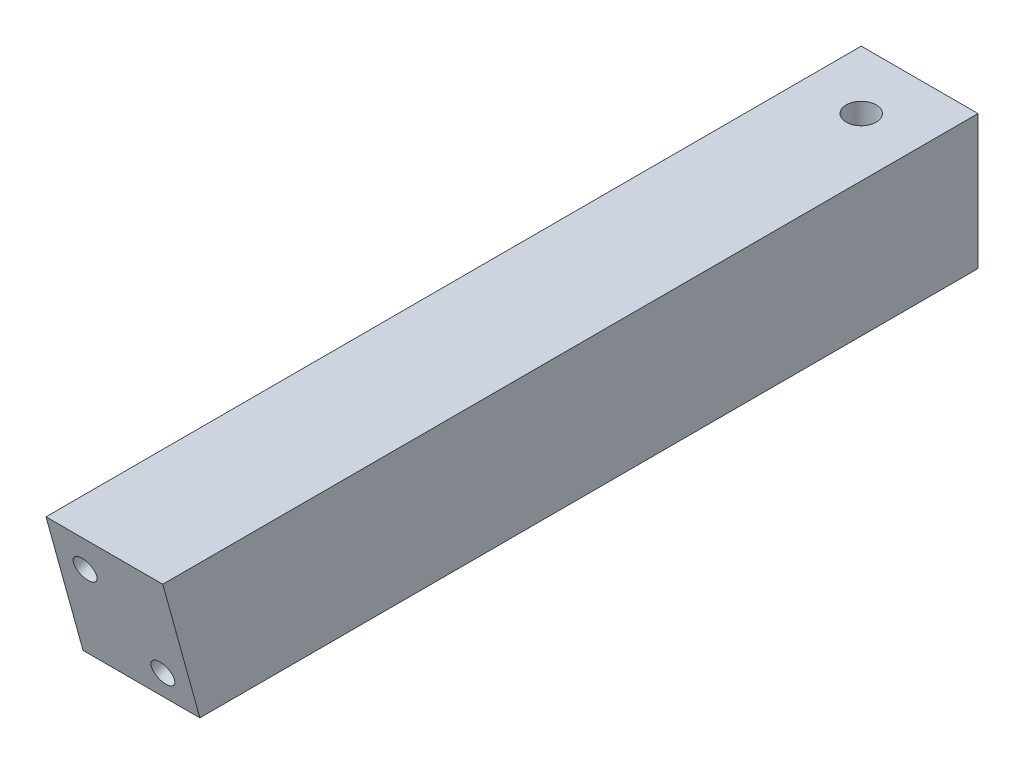
ISO-10303-21;
HEADER;
FILE_DESCRIPTION(('STEP AP214'),'2;1');
FILE_NAME('part.step','',(''),(''),'','','');
FILE_SCHEMA(('AUTOMOTIVE_DESIGN { 1 0 10303 214 1 1 1 1 }'));
ENDSEC;
DATA;
#1=APPLICATION_CONTEXT('core data for automotive mechanical design processes');
#2=APPLICATION_PROTOCOL_DEFINITION('international standard','automotive_design',2000,#1);
#3=PRODUCT_CONTEXT('',#1,'mechanical');
#4=PRODUCT('Part','Part','',(#3));
#5=PRODUCT_RELATED_PRODUCT_CATEGORY('part','',(#4));
#6=PRODUCT_DEFINITION_FORMATION('','',#4);
#7=PRODUCT_DEFINITION_CONTEXT('part definition',#1,'design');
#8=PRODUCT_DEFINITION('design','',#6,#7);
#9=PRODUCT_DEFINITION_SHAPE('','',#8);
#10=(LENGTH_UNIT() NAMED_UNIT(*) SI_UNIT(.MILLI.,.METRE.));
#11=(NAMED_UNIT(*) PLANE_ANGLE_UNIT() SI_UNIT($,.RADIAN.));
#12=(NAMED_UNIT(*) SI_UNIT($,.STERADIAN.) SOLID_ANGLE_UNIT());
#13=UNCERTAINTY_MEASURE_WITH_UNIT(LENGTH_MEASURE(1.E-05),#10,'distance_accuracy_value','');
#14=(GEOMETRIC_REPRESENTATION_CONTEXT(3) GLOBAL_UNCERTAINTY_ASSIGNED_CONTEXT((#13)) GLOBAL_UNIT_ASSIGNED_CONTEXT((#10,
#11,#12)) REPRESENTATION_CONTEXT('',''));
#15=CARTESIAN_POINT('',(0.,0.,0.));
#16=DIRECTION('',(0.,0.,1.));
#17=DIRECTION('',(1.,0.,0.));
#18=AXIS2_PLACEMENT_3D('',#15,#16,#17);
#19=CARTESIAN_POINT('',(-233.303265585855,-866.048105190081,-78.4937864077664));
#20=DIRECTION('',(0.,-0.266119959453495,0.963939918864485));
#21=DIRECTION('',(0.,0.963939918864485,0.266119959453495));
#22=AXIS2_PLACEMENT_3D('',#19,#20,#21);
#23=PLANE('',#22);
#24=CARTESIAN_POINT('',(6.35,-8.48398151521049,158.258448202419));
#25=DIRECTION('',(0.,0.266119959453495,-0.963939918864485));
#26=DIRECTION('',(0.,0.963939918864485,0.266119959453495));
#27=AXIS2_PLACEMENT_3D('',#24,#25,#26);
#28=CIRCLE('',#27,2.52730000000012);
#29=CARTESIAN_POINT('',(6.35,-6.04781615826416,158.931013175946));
#30=VERTEX_POINT('',#29);
#31=EDGE_CURVE('E135',#30,#30,#28,.T.);
#32=ORIENTED_EDGE('',*,*,#31,.T.);
#33=EDGE_LOOP('',(#32));
#34=FACE_BOUND('',#33,.T.);
#35=CARTESIAN_POINT('',(-6.35,6.8185646967632,162.483102558744));
#36=DIRECTION('',(0.,0.266119959453495,-0.963939918864485));
#37=DIRECTION('',(0.,0.963939918864485,0.266119959453495));
#38=AXIS2_PLACEMENT_3D('',#35,#36,#37);
#39=CIRCLE('',#38,2.52730000000013);
#40=CARTESIAN_POINT('',(-6.35,9.25473005370954,163.15566753227));
#41=VERTEX_POINT('',#40);
#42=EDGE_CURVE('E138',#41,#41,#39,.T.);
#43=ORIENTED_EDGE('',*,*,#42,.T.);
#44=EDGE_LOOP('',(#43));
#45=FACE_BOUND('',#44,.T.);
#46=DIRECTION('',(0.,0.963939918864485,0.266119959453495));
#47=VECTOR('',#46,1.);
#48=CARTESIAN_POINT('',(12.7,-3.45517927347841,159.646776066511));
#49=LINE('',#48,#47);
#50=CARTESIAN_POINT('',(12.7,-14.605,156.56858645989));
#51=VERTEX_POINT('',#50);
#52=CARTESIAN_POINT('',(12.7,14.605,164.632744675055));
#53=VERTEX_POINT('',#52);
#54=EDGE_CURVE('E48',#51,#53,#49,.T.);
#55=ORIENTED_EDGE('',*,*,#54,.T.);
#56=DIRECTION('',(-1.,0.,0.));
#57=VECTOR('',#56,1.);
#58=CARTESIAN_POINT('',(-12.7,14.605,164.632744675055));
#59=LINE('',#58,#57);
#60=CARTESIAN_POINT('',(-12.7,14.605,164.632744675055));
#61=VERTEX_POINT('',#60);
#62=EDGE_CURVE('E99',#53,#61,#59,.T.);
#63=ORIENTED_EDGE('',*,*,#62,.T.);
#64=DIRECTION('',(0.,-0.963939918864485,-0.266119959453495));
#65=VECTOR('',#64,1.);
#66=CARTESIAN_POINT('',(-12.7,-3.45517927347841,159.646776066511));
#67=LINE('',#66,#65);
#68=CARTESIAN_POINT('',(-12.7,-14.605,156.56858645989));
#69=VERTEX_POINT('',#68);
#70=EDGE_CURVE('E111',#61,#69,#67,.T.);
#71=ORIENTED_EDGE('',*,*,#70,.T.);
#72=DIRECTION('',(1.,0.,0.));
#73=VECTOR('',#72,1.);
#74=CARTESIAN_POINT('',(-12.7,-14.605,156.56858645989));
#75=LINE('',#74,#73);
#76=EDGE_CURVE('E104',#69,#51,#75,.T.);
#77=ORIENTED_EDGE('',*,*,#76,.T.);
#78=EDGE_LOOP('',(#55,#63,#71,#77));
#79=FACE_BOUND('',#78,.T.);
#80=ADVANCED_FACE('F41',(#34,#45,#79),#23,.T.);
#81=CARTESIAN_POINT('',(-12.7,14.605,200.03366515423));
#82=DIRECTION('',(0.,1.,0.));
#83=DIRECTION('',(0.,0.,-1.));
#84=AXIS2_PLACEMENT_3D('',#81,#82,#83);
#85=PLANE('',#84);
#86=CARTESIAN_POINT('',(0.,14.605,0.));
#87=DIRECTION('',(0.,1.,0.));
#88=DIRECTION('',(0.,0.,1.));
#89=AXIS2_PLACEMENT_3D('',#86,#87,#88);
#90=CIRCLE('',#89,3.2639);
#91=CARTESIAN_POINT('',(0.,14.605,3.2639));
#92=VERTEX_POINT('',#91);
#93=EDGE_CURVE('E144',#92,#92,#90,.T.);
#94=ORIENTED_EDGE('',*,*,#93,.F.);
#95=EDGE_LOOP('',(#94));
#96=FACE_BOUND('',#95,.T.);
#97=DIRECTION('',(0.,0.,-1.));
#98=VECTOR('',#97,1.);
#99=CARTESIAN_POINT('',(12.7,14.605,200.03366515423));
#100=LINE('',#99,#98);
#101=CARTESIAN_POINT('',(12.7,14.605,-12.7));
#102=VERTEX_POINT('',#101);
#103=EDGE_CURVE('E11',#53,#102,#100,.T.);
#104=ORIENTED_EDGE('',*,*,#103,.T.);
#105=DIRECTION('',(-1.,0.,0.));
#106=VECTOR('',#105,1.);
#107=CARTESIAN_POINT('',(-12.7,14.605,-12.7));
#108=LINE('',#107,#106);
#109=CARTESIAN_POINT('',(-12.7,14.605,-12.7));
#110=VERTEX_POINT('',#109);
#111=EDGE_CURVE('E90',#102,#110,#108,.T.);
#112=ORIENTED_EDGE('',*,*,#111,.T.);
#113=DIRECTION('',(0.,0.,-1.));
#114=VECTOR('',#113,1.);
#115=CARTESIAN_POINT('',(-12.7,14.605,200.03366515423));
#116=LINE('',#115,#114);
#117=EDGE_CURVE('E61',#61,#110,#116,.T.);
#118=ORIENTED_EDGE('',*,*,#117,.F.);
#119=ORIENTED_EDGE('',*,*,#62,.F.);
#120=EDGE_LOOP('',(#104,#112,#118,#119));
#121=FACE_BOUND('',#120,.T.);
#122=ADVANCED_FACE('F97',(#96,#121),#85,.T.);
#123=CARTESIAN_POINT('',(-12.7,-14.605,200.03366515423));
#124=DIRECTION('',(-1.,0.,0.));
#125=DIRECTION('',(0.,0.,-1.));
#126=AXIS2_PLACEMENT_3D('',#123,#124,#125);
#127=PLANE('',#126);
#128=ORIENTED_EDGE('',*,*,#117,.T.);
#129=DIRECTION('',(0.,-1.,0.));
#130=VECTOR('',#129,1.);
#131=CARTESIAN_POINT('',(-12.7,-14.605,-12.7));
#132=LINE('',#131,#130);
#133=CARTESIAN_POINT('',(-12.7,-14.605,-12.7));
#134=VERTEX_POINT('',#133);
#135=EDGE_CURVE('E95',#110,#134,#132,.T.);
#136=ORIENTED_EDGE('',*,*,#135,.T.);
#137=DIRECTION('',(0.,0.,-1.));
#138=VECTOR('',#137,1.);
#139=CARTESIAN_POINT('',(-12.7,-14.605,200.03366515423));
#140=LINE('',#139,#138);
#141=EDGE_CURVE('E110',#69,#134,#140,.T.);
#142=ORIENTED_EDGE('',*,*,#141,.F.);
#143=ORIENTED_EDGE('',*,*,#70,.F.);
#144=EDGE_LOOP('',(#128,#136,#142,#143));
#145=FACE_BOUND('',#144,.T.);
#146=ADVANCED_FACE('F114',(#145),#127,.T.);
#147=CARTESIAN_POINT('',(-12.7,-14.605,200.03366515423));
#148=DIRECTION('',(0.,-1.,0.));
#149=DIRECTION('',(0.,0.,1.));
#150=AXIS2_PLACEMENT_3D('',#147,#148,#149);
#151=PLANE('',#150);
#152=CARTESIAN_POINT('',(0.,-14.605,0.));
#153=DIRECTION('',(0.,1.,0.));
#154=DIRECTION('',(0.,0.,1.));
#155=AXIS2_PLACEMENT_3D('',#152,#153,#154);
#156=CIRCLE('',#155,3.2639);
#157=CARTESIAN_POINT('',(0.,-14.605,3.2639));
#158=VERTEX_POINT('',#157);
#159=EDGE_CURVE('E150',#158,#158,#156,.T.);
#160=ORIENTED_EDGE('',*,*,#159,.T.);
#161=EDGE_LOOP('',(#160));
#162=FACE_BOUND('',#161,.T.);
#163=ORIENTED_EDGE('',*,*,#141,.T.);
#164=DIRECTION('',(1.,0.,0.));
#165=VECTOR('',#164,1.);
#166=CARTESIAN_POINT('',(-12.7,-14.605,-12.7));
#167=LINE('',#166,#165);
#168=CARTESIAN_POINT('',(12.7,-14.605,-12.7));
#169=VERTEX_POINT('',#168);
#170=EDGE_CURVE('E84',#134,#169,#167,.T.);
#171=ORIENTED_EDGE('',*,*,#170,.T.);
#172=DIRECTION('',(0.,0.,-1.));
#173=VECTOR('',#172,1.);
#174=CARTESIAN_POINT('',(12.7,-14.605,200.03366515423));
#175=LINE('',#174,#173);
#176=EDGE_CURVE('E74',#51,#169,#175,.T.);
#177=ORIENTED_EDGE('',*,*,#176,.F.);
#178=ORIENTED_EDGE('',*,*,#76,.F.);
#179=EDGE_LOOP('',(#163,#171,#177,#178));
#180=FACE_BOUND('',#179,.T.);
#181=ADVANCED_FACE('F115',(#162,#180),#151,.T.);
#182=CARTESIAN_POINT('',(12.7,-14.605,200.03366515423));
#183=DIRECTION('',(1.,0.,0.));
#184=DIRECTION('',(0.,0.,1.));
#185=AXIS2_PLACEMENT_3D('',#182,#183,#184);
#186=PLANE('',#185);
#187=ORIENTED_EDGE('',*,*,#176,.T.);
#188=DIRECTION('',(0.,1.,0.));
#189=VECTOR('',#188,1.);
#190=CARTESIAN_POINT('',(12.7,-14.605,-12.7));
#191=LINE('',#190,#189);
#192=EDGE_CURVE('E81',#169,#102,#191,.T.);
#193=ORIENTED_EDGE('',*,*,#192,.T.);
#194=ORIENTED_EDGE('',*,*,#103,.F.);
#195=ORIENTED_EDGE('',*,*,#54,.F.);
#196=EDGE_LOOP('',(#187,#193,#194,#195));
#197=FACE_BOUND('',#196,.T.);
#198=ADVANCED_FACE('F89',(#197),#186,.T.);
#199=CARTESIAN_POINT('',(0.,0.,-12.7));
#200=DIRECTION('',(0.,0.,1.));
#201=DIRECTION('',(-1.,0.,0.));
#202=AXIS2_PLACEMENT_3D('',#199,#200,#201);
#203=PLANE('',#202);
#204=ORIENTED_EDGE('',*,*,#192,.F.);
#205=ORIENTED_EDGE('',*,*,#170,.F.);
#206=ORIENTED_EDGE('',*,*,#135,.F.);
#207=ORIENTED_EDGE('',*,*,#111,.F.);
#208=EDGE_LOOP('',(#204,#205,#206,#207));
#209=FACE_BOUND('',#208,.T.);
#210=ADVANCED_FACE('F93',(#209),#203,.F.);
#211=CARTESIAN_POINT('',(-6.35000000000001,11.0432190530874,147.18055634677));
#212=DIRECTION('',(0.,-0.266119959453495,0.963939918864485));
#213=DIRECTION('',(0.,0.963939918864485,0.266119959453495));
#214=AXIS2_PLACEMENT_3D('',#211,#212,#213);
#215=CYLINDRICAL_SURFACE('',#214,2.52730000000013);
#216=CARTESIAN_POINT('',(-6.35000000000001,11.0432190530874,147.18055634677));
#217=DIRECTION('',(0.,0.266119959453495,-0.963939918864485));
#218=DIRECTION('',(0.,0.963939918864485,0.266119959453495));
#219=AXIS2_PLACEMENT_3D('',#216,#217,#218);
#220=CIRCLE('',#219,2.52730000000013);
#221=CARTESIAN_POINT('',(-6.35000000000001,13.4793844100338,147.853121320297));
#222=VERTEX_POINT('',#221);
#223=EDGE_CURVE('E140',#222,#222,#220,.T.);
#224=ORIENTED_EDGE('',*,*,#223,.T.);
#225=EDGE_LOOP('',(#224));
#226=FACE_BOUND('',#225,.T.);
#227=ORIENTED_EDGE('',*,*,#42,.F.);
#228=EDGE_LOOP('',(#227));
#229=FACE_BOUND('',#228,.T.);
#230=ADVANCED_FACE('F172',(#226,#229),#215,.F.);
#231=CARTESIAN_POINT('',(-6.35000000000001,11.0432190530874,147.18055634677));
#232=DIRECTION('',(0.,-0.266119959453495,0.963939918864485));
#233=DIRECTION('',(0.,0.963939918864485,0.266119959453495));
#234=AXIS2_PLACEMENT_3D('',#231,#232,#233);
#235=PLANE('',#234);
#236=ORIENTED_EDGE('',*,*,#223,.F.);
#237=EDGE_LOOP('',(#236));
#238=FACE_BOUND('',#237,.T.);
#239=ADVANCED_FACE('F170',(#238),#235,.T.);
#240=CARTESIAN_POINT('',(6.34999999999999,-4.25932715888627,142.955901990446));
#241=DIRECTION('',(0.,-0.266119959453495,0.963939918864485));
#242=DIRECTION('',(0.,0.963939918864485,0.266119959453495));
#243=AXIS2_PLACEMENT_3D('',#240,#241,#242);
#244=CYLINDRICAL_SURFACE('',#243,2.52730000000012);
#245=CARTESIAN_POINT('',(6.34999999999999,-4.25932715888627,142.955901990446));
#246=DIRECTION('',(0.,0.266119959453495,-0.963939918864485));
#247=DIRECTION('',(0.,0.963939918864485,0.266119959453495));
#248=AXIS2_PLACEMENT_3D('',#245,#246,#247);
#249=CIRCLE('',#248,2.52730000000012);
#250=CARTESIAN_POINT('',(6.34999999999999,-1.82316180193993,143.628466963972));
#251=VERTEX_POINT('',#250);
#252=EDGE_CURVE('E91',#251,#251,#249,.T.);
#253=ORIENTED_EDGE('',*,*,#252,.T.);
#254=EDGE_LOOP('',(#253));
#255=FACE_BOUND('',#254,.T.);
#256=ORIENTED_EDGE('',*,*,#31,.F.);
#257=EDGE_LOOP('',(#256));
#258=FACE_BOUND('',#257,.T.);
#259=ADVANCED_FACE('F164',(#255,#258),#244,.F.);
#260=CARTESIAN_POINT('',(6.34999999999999,-4.25932715888627,142.955901990446));
#261=DIRECTION('',(0.,-0.266119959453495,0.963939918864485));
#262=DIRECTION('',(0.,0.963939918864485,0.266119959453495));
#263=AXIS2_PLACEMENT_3D('',#260,#261,#262);
#264=PLANE('',#263);
#265=ORIENTED_EDGE('',*,*,#252,.F.);
#266=EDGE_LOOP('',(#265));
#267=FACE_BOUND('',#266,.T.);
#268=ADVANCED_FACE('F158',(#267),#264,.T.);
#269=CARTESIAN_POINT('',(0.,14.605,0.));
#270=DIRECTION('',(0.,-1.,0.));
#271=DIRECTION('',(0.,0.,1.));
#272=AXIS2_PLACEMENT_3D('',#269,#270,#271);
#273=CYLINDRICAL_SURFACE('',#272,3.2639);
#274=CARTESIAN_POINT('',(0.,14.605,3.2639));
#275=CARTESIAN_POINT('',(0.,14.3007291666667,3.2639));
#276=CARTESIAN_POINT('',(0.,13.9964583333333,3.2639));
#277=CARTESIAN_POINT('',(0.,13.3879166666667,3.2639));
#278=CARTESIAN_POINT('',(0.,13.0836458333333,3.2639));
#279=CARTESIAN_POINT('',(0.,12.4751041666667,3.2639));
#280=CARTESIAN_POINT('',(0.,12.1708333333333,3.2639));
#281=CARTESIAN_POINT('',(0.,11.5622916666667,3.2639));
#282=CARTESIAN_POINT('',(0.,11.2580208333333,3.2639));
#283=CARTESIAN_POINT('',(0.,10.6494791666667,3.2639));
#284=CARTESIAN_POINT('',(0.,10.3452083333333,3.2639));
#285=CARTESIAN_POINT('',(0.,9.73666666666667,3.2639));
#286=CARTESIAN_POINT('',(0.,9.43239583333333,3.2639));
#287=CARTESIAN_POINT('',(0.,8.82385416666667,3.2639));
#288=CARTESIAN_POINT('',(0.,8.51958333333333,3.2639));
#289=CARTESIAN_POINT('',(0.,7.91104166666667,3.2639));
#290=CARTESIAN_POINT('',(0.,7.60677083333333,3.2639));
#291=CARTESIAN_POINT('',(0.,6.99822916666667,3.2639));
#292=CARTESIAN_POINT('',(0.,6.69395833333333,3.2639));
#293=CARTESIAN_POINT('',(0.,6.08541666666667,3.2639));
#294=CARTESIAN_POINT('',(0.,5.78114583333333,3.2639));
#295=CARTESIAN_POINT('',(0.,5.17260416666667,3.2639));
#296=CARTESIAN_POINT('',(0.,4.86833333333333,3.2639));
#297=CARTESIAN_POINT('',(0.,4.25979166666667,3.2639));
#298=CARTESIAN_POINT('',(0.,3.95552083333334,3.2639));
#299=CARTESIAN_POINT('',(0.,3.34697916666667,3.2639));
#300=CARTESIAN_POINT('',(0.,3.04270833333333,3.2639));
#301=CARTESIAN_POINT('',(0.,2.43416666666667,3.2639));
#302=CARTESIAN_POINT('',(0.,2.12989583333334,3.2639));
#303=CARTESIAN_POINT('',(0.,1.52135416666667,3.2639));
#304=CARTESIAN_POINT('',(0.,1.21708333333334,3.2639));
#305=CARTESIAN_POINT('',(0.,0.608541666666669,3.2639));
#306=CARTESIAN_POINT('',(0.,0.304270833333335,3.2639));
#307=CARTESIAN_POINT('',(0.,-0.304270833333332,3.2639));
#308=CARTESIAN_POINT('',(0.,-0.608541666666665,3.2639));
#309=CARTESIAN_POINT('',(0.,-1.21708333333333,3.2639));
#310=CARTESIAN_POINT('',(0.,-1.52135416666666,3.2639));
#311=CARTESIAN_POINT('',(0.,-2.12989583333333,3.2639));
#312=CARTESIAN_POINT('',(0.,-2.43416666666666,3.2639));
#313=CARTESIAN_POINT('',(0.,-3.04270833333333,3.2639));
#314=CARTESIAN_POINT('',(0.,-3.34697916666666,3.2639));
#315=CARTESIAN_POINT('',(0.,-3.95552083333333,3.2639));
#316=CARTESIAN_POINT('',(0.,-4.25979166666666,3.2639));
#317=CARTESIAN_POINT('',(0.,-4.86833333333333,3.2639));
#318=CARTESIAN_POINT('',(0.,-5.17260416666666,3.2639));
#319=CARTESIAN_POINT('',(0.,-5.78114583333333,3.2639));
#320=CARTESIAN_POINT('',(0.,-6.08541666666666,3.2639));
#321=CARTESIAN_POINT('',(0.,-6.69395833333333,3.2639));
#322=CARTESIAN_POINT('',(0.,-6.99822916666666,3.2639));
#323=CARTESIAN_POINT('',(0.,-7.60677083333333,3.2639));
#324=CARTESIAN_POINT('',(0.,-7.91104166666666,3.2639));
#325=CARTESIAN_POINT('',(0.,-8.51958333333333,3.2639));
#326=CARTESIAN_POINT('',(0.,-8.82385416666666,3.2639));
#327=CARTESIAN_POINT('',(0.,-9.43239583333333,3.2639));
#328=CARTESIAN_POINT('',(0.,-9.73666666666666,3.2639));
#329=CARTESIAN_POINT('',(0.,-10.3452083333333,3.2639));
#330=CARTESIAN_POINT('',(0.,-10.6494791666667,3.2639));
#331=CARTESIAN_POINT('',(0.,-11.2580208333333,3.2639));
#332=CARTESIAN_POINT('',(0.,-11.5622916666667,3.2639));
#333=CARTESIAN_POINT('',(0.,-12.1708333333333,3.2639));
#334=CARTESIAN_POINT('',(0.,-12.4751041666667,3.2639));
#335=CARTESIAN_POINT('',(0.,-13.0836458333333,3.2639));
#336=CARTESIAN_POINT('',(0.,-13.3879166666667,3.2639));
#337=CARTESIAN_POINT('',(0.,-13.9964583333333,3.2639));
#338=CARTESIAN_POINT('',(0.,-14.3007291666667,3.2639));
#339=CARTESIAN_POINT('',(0.,-14.605,3.2639));
#340=B_SPLINE_CURVE_WITH_KNOTS('',3,(#274,#275,#276,#277,#278,#279,#280,#281,#282,#283,#284,
#285,#286,#287,#288,#289,#290,#291,#292,#293,#294,#295,#296,#297,#298,#299,#300,#301,#302,#303,
#304,#305,#306,#307,#308,#309,#310,#311,#312,#313,#314,#315,#316,#317,#318,#319,#320,#321,#322,
#323,#324,#325,#326,#327,#328,#329,#330,#331,#332,#333,#334,#335,#336,#337,#338,#339),
.UNSPECIFIED.,.F.,.F.,(4,2,2,2,2,2,2,2,2,2,2,2,2,2,2,2,2,2,2,2,2,2,2,2,2,2,2,2,2,2,2,2,4),(0.,
0.9128125,1.825625,2.7384375,3.65125,4.5640625,5.476875,6.3896875,7.3025,8.2153125,9.128125,
10.0409375,10.95375,11.8665625,12.779375,13.6921875,14.605,15.5178125,16.430625,17.3434375,
18.25625,19.1690625,20.081875,20.9946875,21.9075,22.8203125,23.733125,24.6459375,25.55875,
26.4715625,27.384375,28.2971875,29.21),.UNSPECIFIED.);
#341=EDGE_CURVE('BSEAM155',#92,#158,#340,.T.);
#342=ORIENTED_EDGE('',*,*,#93,.T.);
#343=ORIENTED_EDGE('',*,*,#159,.F.);
#344=ORIENTED_EDGE('',*,*,#341,.T.);
#345=ORIENTED_EDGE('',*,*,#341,.F.);
#346=EDGE_LOOP('',(#342,#344,#343,#345));
#347=FACE_BOUND('',#346,.T.);
#348=ADVANCED_FACE('F155',(#347),#273,.F.);
#349=CLOSED_SHELL('',(#80,#122,#146,#181,#198,#210,#230,#239,#259,#268,#348));
#350=MANIFOLD_SOLID_BREP('B2',#349);
#351=ADVANCED_BREP_SHAPE_REPRESENTATION('',(#18,#350),#14);
#352=SHAPE_DEFINITION_REPRESENTATION(#9,#351);
ENDSEC;
END-ISO-10303-21;
